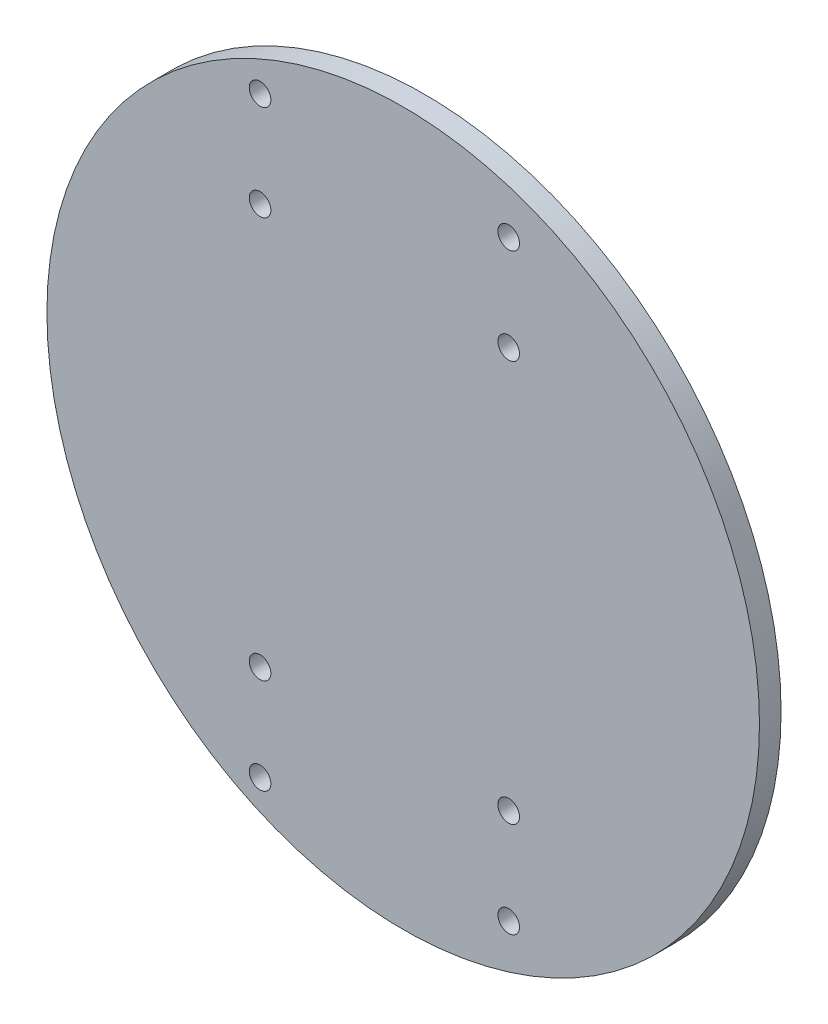
ISO-10303-21;
HEADER;
FILE_DESCRIPTION(('STEP AP214'),'2;1');
FILE_NAME('part.step','',(''),(''),'','','');
FILE_SCHEMA(('AUTOMOTIVE_DESIGN { 1 0 10303 214 1 1 1 1 }'));
ENDSEC;
DATA;
#1=APPLICATION_CONTEXT('core data for automotive mechanical design processes');
#2=APPLICATION_PROTOCOL_DEFINITION('international standard','automotive_design',2000,#1);
#3=PRODUCT_CONTEXT('',#1,'mechanical');
#4=PRODUCT('Part','Part','',(#3));
#5=PRODUCT_RELATED_PRODUCT_CATEGORY('part','',(#4));
#6=PRODUCT_DEFINITION_FORMATION('','',#4);
#7=PRODUCT_DEFINITION_CONTEXT('part definition',#1,'design');
#8=PRODUCT_DEFINITION('design','',#6,#7);
#9=PRODUCT_DEFINITION_SHAPE('','',#8);
#10=(LENGTH_UNIT() NAMED_UNIT(*) SI_UNIT(.MILLI.,.METRE.));
#11=(NAMED_UNIT(*) PLANE_ANGLE_UNIT() SI_UNIT($,.RADIAN.));
#12=(NAMED_UNIT(*) SI_UNIT($,.STERADIAN.) SOLID_ANGLE_UNIT());
#13=UNCERTAINTY_MEASURE_WITH_UNIT(LENGTH_MEASURE(1.E-05),#10,'distance_accuracy_value','');
#14=(GEOMETRIC_REPRESENTATION_CONTEXT(3) GLOBAL_UNCERTAINTY_ASSIGNED_CONTEXT((#13)) GLOBAL_UNIT_ASSIGNED_CONTEXT((#10,
#11,#12)) REPRESENTATION_CONTEXT('',''));
#15=CARTESIAN_POINT('',(0.,0.,0.));
#16=DIRECTION('',(0.,0.,1.));
#17=DIRECTION('',(1.,0.,0.));
#18=AXIS2_PLACEMENT_3D('',#15,#16,#17);
#19=CARTESIAN_POINT('',(0.,0.,5.));
#20=DIRECTION('',(0.,0.,1.));
#21=DIRECTION('',(1.,0.,0.));
#22=AXIS2_PLACEMENT_3D('',#19,#20,#21);
#23=PLANE('',#22);
#24=CARTESIAN_POINT('',(24.405,68.49,5.));
#25=DIRECTION('',(0.,0.,1.));
#26=DIRECTION('',(1.,0.,0.));
#27=AXIS2_PLACEMENT_3D('',#24,#25,#26);
#28=CIRCLE('',#27,2.5);
#29=CARTESIAN_POINT('',(26.905,68.49,5.));
#30=VERTEX_POINT('',#29);
#31=EDGE_CURVE('E156',#30,#30,#28,.F.);
#32=ORIENTED_EDGE('',*,*,#31,.T.);
#33=EDGE_LOOP('',(#32));
#34=FACE_BOUND('',#33,.T.);
#35=CARTESIAN_POINT('',(24.405,46.39,5.));
#36=DIRECTION('',(0.,0.,1.));
#37=DIRECTION('',(1.,0.,0.));
#38=AXIS2_PLACEMENT_3D('',#35,#36,#37);
#39=CIRCLE('',#38,2.5);
#40=CARTESIAN_POINT('',(26.905,46.39,5.));
#41=VERTEX_POINT('',#40);
#42=EDGE_CURVE('E158',#41,#41,#39,.F.);
#43=ORIENTED_EDGE('',*,*,#42,.T.);
#44=EDGE_LOOP('',(#43));
#45=FACE_BOUND('',#44,.T.);
#46=CARTESIAN_POINT('',(-33.115,46.39,5.));
#47=DIRECTION('',(0.,0.,1.));
#48=DIRECTION('',(1.,0.,0.));
#49=AXIS2_PLACEMENT_3D('',#46,#47,#48);
#50=CIRCLE('',#49,2.5);
#51=CARTESIAN_POINT('',(-30.615,46.39,5.));
#52=VERTEX_POINT('',#51);
#53=EDGE_CURVE('E163',#52,#52,#50,.F.);
#54=ORIENTED_EDGE('',*,*,#53,.T.);
#55=EDGE_LOOP('',(#54));
#56=FACE_BOUND('',#55,.T.);
#57=CARTESIAN_POINT('',(-33.115,68.49,5.));
#58=DIRECTION('',(0.,0.,1.));
#59=DIRECTION('',(1.,0.,0.));
#60=AXIS2_PLACEMENT_3D('',#57,#58,#59);
#61=CIRCLE('',#60,2.5);
#62=CARTESIAN_POINT('',(-30.615,68.49,5.));
#63=VERTEX_POINT('',#62);
#64=EDGE_CURVE('E60',#63,#63,#61,.F.);
#65=ORIENTED_EDGE('',*,*,#64,.T.);
#66=EDGE_LOOP('',(#65));
#67=FACE_BOUND('',#66,.T.);
#68=CARTESIAN_POINT('',(0.,0.,5.));
#69=DIRECTION('',(0.,0.,1.));
#70=DIRECTION('',(1.,0.,0.));
#71=AXIS2_PLACEMENT_3D('',#68,#69,#70);
#72=CIRCLE('',#71,82.42);
#73=CARTESIAN_POINT('',(82.42,0.,5.));
#74=VERTEX_POINT('',#73);
#75=EDGE_CURVE('E10',#74,#74,#72,.T.);
#76=ORIENTED_EDGE('',*,*,#75,.T.);
#77=EDGE_LOOP('',(#76));
#78=FACE_BOUND('',#77,.T.);
#79=CARTESIAN_POINT('',(-33.115,-68.49,5.));
#80=DIRECTION('',(0.,0.,1.));
#81=DIRECTION('',(1.,0.,0.));
#82=AXIS2_PLACEMENT_3D('',#79,#80,#81);
#83=CIRCLE('',#82,2.5);
#84=CARTESIAN_POINT('',(-30.615,-68.49,5.));
#85=VERTEX_POINT('',#84);
#86=EDGE_CURVE('E173',#85,#85,#83,.T.);
#87=ORIENTED_EDGE('',*,*,#86,.F.);
#88=EDGE_LOOP('',(#87));
#89=FACE_BOUND('',#88,.T.);
#90=CARTESIAN_POINT('',(24.405,-46.39,5.));
#91=DIRECTION('',(0.,0.,1.));
#92=DIRECTION('',(1.,0.,0.));
#93=AXIS2_PLACEMENT_3D('',#90,#91,#92);
#94=CIRCLE('',#93,2.5);
#95=CARTESIAN_POINT('',(26.905,-46.39,5.));
#96=VERTEX_POINT('',#95);
#97=EDGE_CURVE('E166',#96,#96,#94,.T.);
#98=ORIENTED_EDGE('',*,*,#97,.F.);
#99=EDGE_LOOP('',(#98));
#100=FACE_BOUND('',#99,.T.);
#101=CARTESIAN_POINT('',(24.405,-68.49,5.));
#102=DIRECTION('',(0.,0.,1.));
#103=DIRECTION('',(1.,0.,0.));
#104=AXIS2_PLACEMENT_3D('',#101,#102,#103);
#105=CIRCLE('',#104,2.5);
#106=CARTESIAN_POINT('',(26.905,-68.49,5.));
#107=VERTEX_POINT('',#106);
#108=EDGE_CURVE('E180',#107,#107,#105,.T.);
#109=ORIENTED_EDGE('',*,*,#108,.F.);
#110=EDGE_LOOP('',(#109));
#111=FACE_BOUND('',#110,.T.);
#112=CARTESIAN_POINT('',(-33.115,-46.39,5.));
#113=DIRECTION('',(0.,0.,1.));
#114=DIRECTION('',(1.,0.,0.));
#115=AXIS2_PLACEMENT_3D('',#112,#113,#114);
#116=CIRCLE('',#115,2.5);
#117=CARTESIAN_POINT('',(-30.615,-46.39,5.));
#118=VERTEX_POINT('',#117);
#119=EDGE_CURVE('E171',#118,#118,#116,.T.);
#120=ORIENTED_EDGE('',*,*,#119,.F.);
#121=EDGE_LOOP('',(#120));
#122=FACE_BOUND('',#121,.T.);
#123=ADVANCED_FACE('F43',(#34,#45,#56,#67,#78,#89,#100,#111,#122),#23,.T.);
#124=CARTESIAN_POINT('',(0.,0.,0.));
#125=DIRECTION('',(0.,0.,1.));
#126=DIRECTION('',(1.,0.,0.));
#127=AXIS2_PLACEMENT_3D('',#124,#125,#126);
#128=PLANE('',#127);
#129=CARTESIAN_POINT('',(24.405,68.49,0.));
#130=DIRECTION('',(0.,0.,1.));
#131=DIRECTION('',(1.,0.,0.));
#132=AXIS2_PLACEMENT_3D('',#129,#130,#131);
#133=CIRCLE('',#132,2.5);
#134=CARTESIAN_POINT('',(26.905,68.49,0.));
#135=VERTEX_POINT('',#134);
#136=EDGE_CURVE('E47',#135,#135,#133,.F.);
#137=ORIENTED_EDGE('',*,*,#136,.F.);
#138=EDGE_LOOP('',(#137));
#139=FACE_BOUND('',#138,.T.);
#140=CARTESIAN_POINT('',(24.405,46.39,0.));
#141=DIRECTION('',(0.,0.,1.));
#142=DIRECTION('',(1.,0.,0.));
#143=AXIS2_PLACEMENT_3D('',#140,#141,#142);
#144=CIRCLE('',#143,2.5);
#145=CARTESIAN_POINT('',(26.905,46.39,0.));
#146=VERTEX_POINT('',#145);
#147=EDGE_CURVE('E86',#146,#146,#144,.F.);
#148=ORIENTED_EDGE('',*,*,#147,.F.);
#149=EDGE_LOOP('',(#148));
#150=FACE_BOUND('',#149,.T.);
#151=CARTESIAN_POINT('',(-33.115,46.39,0.));
#152=DIRECTION('',(0.,0.,1.));
#153=DIRECTION('',(1.,0.,0.));
#154=AXIS2_PLACEMENT_3D('',#151,#152,#153);
#155=CIRCLE('',#154,2.5);
#156=CARTESIAN_POINT('',(-30.615,46.39,0.));
#157=VERTEX_POINT('',#156);
#158=EDGE_CURVE('E83',#157,#157,#155,.F.);
#159=ORIENTED_EDGE('',*,*,#158,.F.);
#160=EDGE_LOOP('',(#159));
#161=FACE_BOUND('',#160,.T.);
#162=CARTESIAN_POINT('',(24.405,-68.49,0.));
#163=DIRECTION('',(0.,0.,1.));
#164=DIRECTION('',(1.,0.,0.));
#165=AXIS2_PLACEMENT_3D('',#162,#163,#164);
#166=CIRCLE('',#165,2.5);
#167=CARTESIAN_POINT('',(26.905,-68.49,0.));
#168=VERTEX_POINT('',#167);
#169=EDGE_CURVE('E75',#168,#168,#166,.T.);
#170=ORIENTED_EDGE('',*,*,#169,.T.);
#171=EDGE_LOOP('',(#170));
#172=FACE_BOUND('',#171,.T.);
#173=CARTESIAN_POINT('',(-33.115,-68.49,0.));
#174=DIRECTION('',(0.,0.,1.));
#175=DIRECTION('',(1.,0.,0.));
#176=AXIS2_PLACEMENT_3D('',#173,#174,#175);
#177=CIRCLE('',#176,2.5);
#178=CARTESIAN_POINT('',(-30.615,-68.49,0.));
#179=VERTEX_POINT('',#178);
#180=EDGE_CURVE('E67',#179,#179,#177,.T.);
#181=ORIENTED_EDGE('',*,*,#180,.T.);
#182=EDGE_LOOP('',(#181));
#183=FACE_BOUND('',#182,.T.);
#184=CARTESIAN_POINT('',(-33.115,68.49,0.));
#185=DIRECTION('',(0.,0.,1.));
#186=DIRECTION('',(1.,0.,0.));
#187=AXIS2_PLACEMENT_3D('',#184,#185,#186);
#188=CIRCLE('',#187,2.5);
#189=CARTESIAN_POINT('',(-30.615,68.49,0.));
#190=VERTEX_POINT('',#189);
#191=EDGE_CURVE('E63',#190,#190,#188,.F.);
#192=ORIENTED_EDGE('',*,*,#191,.F.);
#193=EDGE_LOOP('',(#192));
#194=FACE_BOUND('',#193,.T.);
#195=CARTESIAN_POINT('',(0.,0.,0.));
#196=DIRECTION('',(0.,0.,1.));
#197=DIRECTION('',(1.,0.,0.));
#198=AXIS2_PLACEMENT_3D('',#195,#196,#197);
#199=CIRCLE('',#198,82.42);
#200=CARTESIAN_POINT('',(82.42,0.,0.));
#201=VERTEX_POINT('',#200);
#202=EDGE_CURVE('E52',#201,#201,#199,.T.);
#203=ORIENTED_EDGE('',*,*,#202,.F.);
#204=EDGE_LOOP('',(#203));
#205=FACE_BOUND('',#204,.T.);
#206=CARTESIAN_POINT('',(24.405,-46.39,0.));
#207=DIRECTION('',(0.,0.,1.));
#208=DIRECTION('',(1.,0.,0.));
#209=AXIS2_PLACEMENT_3D('',#206,#207,#208);
#210=CIRCLE('',#209,2.5);
#211=CARTESIAN_POINT('',(26.905,-46.39,0.));
#212=VERTEX_POINT('',#211);
#213=EDGE_CURVE('E71',#212,#212,#210,.T.);
#214=ORIENTED_EDGE('',*,*,#213,.T.);
#215=EDGE_LOOP('',(#214));
#216=FACE_BOUND('',#215,.T.);
#217=CARTESIAN_POINT('',(-33.115,-46.39,0.));
#218=DIRECTION('',(0.,0.,1.));
#219=DIRECTION('',(1.,0.,0.));
#220=AXIS2_PLACEMENT_3D('',#217,#218,#219);
#221=CIRCLE('',#220,2.5);
#222=CARTESIAN_POINT('',(-30.615,-46.39,0.));
#223=VERTEX_POINT('',#222);
#224=EDGE_CURVE('E79',#223,#223,#221,.T.);
#225=ORIENTED_EDGE('',*,*,#224,.T.);
#226=EDGE_LOOP('',(#225));
#227=FACE_BOUND('',#226,.T.);
#228=ADVANCED_FACE('F97',(#139,#150,#161,#172,#183,#194,#205,#216,#227),#128,.F.);
#229=CARTESIAN_POINT('',(0.,0.,5.));
#230=DIRECTION('',(0.,0.,-1.));
#231=DIRECTION('',(-1.,0.,0.));
#232=AXIS2_PLACEMENT_3D('',#229,#230,#231);
#233=CYLINDRICAL_SURFACE('',#232,82.42);
#234=ORIENTED_EDGE('',*,*,#75,.F.);
#235=EDGE_LOOP('',(#234));
#236=FACE_BOUND('',#235,.T.);
#237=ORIENTED_EDGE('',*,*,#202,.T.);
#238=EDGE_LOOP('',(#237));
#239=FACE_BOUND('',#238,.T.);
#240=ADVANCED_FACE('F45',(#236,#239),#233,.T.);
#241=CARTESIAN_POINT('',(-33.115,68.49,-5.));
#242=DIRECTION('',(0.,0.,1.));
#243=DIRECTION('',(1.,0.,0.));
#244=AXIS2_PLACEMENT_3D('',#241,#242,#243);
#245=CYLINDRICAL_SURFACE('',#244,2.5);
#246=ORIENTED_EDGE('',*,*,#64,.F.);
#247=EDGE_LOOP('',(#246));
#248=FACE_BOUND('',#247,.T.);
#249=ORIENTED_EDGE('',*,*,#191,.T.);
#250=EDGE_LOOP('',(#249));
#251=FACE_BOUND('',#250,.T.);
#252=ADVANCED_FACE('F141',(#248,#251),#245,.F.);
#253=CARTESIAN_POINT('',(-33.115,-68.49,-5.));
#254=DIRECTION('',(0.,0.,1.));
#255=DIRECTION('',(1.,0.,0.));
#256=AXIS2_PLACEMENT_3D('',#253,#254,#255);
#257=CYLINDRICAL_SURFACE('',#256,2.5);
#258=ORIENTED_EDGE('',*,*,#86,.T.);
#259=EDGE_LOOP('',(#258));
#260=FACE_BOUND('',#259,.T.);
#261=ORIENTED_EDGE('',*,*,#180,.F.);
#262=EDGE_LOOP('',(#261));
#263=FACE_BOUND('',#262,.T.);
#264=ADVANCED_FACE('F143',(#260,#263),#257,.F.);
#265=CARTESIAN_POINT('',(24.405,-46.39,-5.));
#266=DIRECTION('',(0.,0.,1.));
#267=DIRECTION('',(1.,0.,0.));
#268=AXIS2_PLACEMENT_3D('',#265,#266,#267);
#269=CYLINDRICAL_SURFACE('',#268,2.5);
#270=ORIENTED_EDGE('',*,*,#97,.T.);
#271=EDGE_LOOP('',(#270));
#272=FACE_BOUND('',#271,.T.);
#273=ORIENTED_EDGE('',*,*,#213,.F.);
#274=EDGE_LOOP('',(#273));
#275=FACE_BOUND('',#274,.T.);
#276=ADVANCED_FACE('F128',(#272,#275),#269,.F.);
#277=CARTESIAN_POINT('',(24.405,-68.49,-5.));
#278=DIRECTION('',(0.,0.,1.));
#279=DIRECTION('',(1.,0.,0.));
#280=AXIS2_PLACEMENT_3D('',#277,#278,#279);
#281=CYLINDRICAL_SURFACE('',#280,2.5);
#282=ORIENTED_EDGE('',*,*,#108,.T.);
#283=EDGE_LOOP('',(#282));
#284=FACE_BOUND('',#283,.T.);
#285=ORIENTED_EDGE('',*,*,#169,.F.);
#286=EDGE_LOOP('',(#285));
#287=FACE_BOUND('',#286,.T.);
#288=ADVANCED_FACE('F118',(#284,#287),#281,.F.);
#289=CARTESIAN_POINT('',(-33.115,-46.39,-5.));
#290=DIRECTION('',(0.,0.,1.));
#291=DIRECTION('',(1.,0.,0.));
#292=AXIS2_PLACEMENT_3D('',#289,#290,#291);
#293=CYLINDRICAL_SURFACE('',#292,2.5);
#294=ORIENTED_EDGE('',*,*,#119,.T.);
#295=EDGE_LOOP('',(#294));
#296=FACE_BOUND('',#295,.T.);
#297=ORIENTED_EDGE('',*,*,#224,.F.);
#298=EDGE_LOOP('',(#297));
#299=FACE_BOUND('',#298,.T.);
#300=ADVANCED_FACE('F115',(#296,#299),#293,.F.);
#301=CARTESIAN_POINT('',(-33.115,46.39,-5.));
#302=DIRECTION('',(0.,0.,1.));
#303=DIRECTION('',(1.,0.,0.));
#304=AXIS2_PLACEMENT_3D('',#301,#302,#303);
#305=CYLINDRICAL_SURFACE('',#304,2.5);
#306=ORIENTED_EDGE('',*,*,#53,.F.);
#307=EDGE_LOOP('',(#306));
#308=FACE_BOUND('',#307,.T.);
#309=ORIENTED_EDGE('',*,*,#158,.T.);
#310=EDGE_LOOP('',(#309));
#311=FACE_BOUND('',#310,.T.);
#312=ADVANCED_FACE('F117',(#308,#311),#305,.F.);
#313=CARTESIAN_POINT('',(24.405,46.39,-5.));
#314=DIRECTION('',(0.,0.,1.));
#315=DIRECTION('',(1.,0.,0.));
#316=AXIS2_PLACEMENT_3D('',#313,#314,#315);
#317=CYLINDRICAL_SURFACE('',#316,2.5);
#318=ORIENTED_EDGE('',*,*,#42,.F.);
#319=EDGE_LOOP('',(#318));
#320=FACE_BOUND('',#319,.T.);
#321=ORIENTED_EDGE('',*,*,#147,.T.);
#322=EDGE_LOOP('',(#321));
#323=FACE_BOUND('',#322,.T.);
#324=ADVANCED_FACE('F125',(#320,#323),#317,.F.);
#325=CARTESIAN_POINT('',(24.405,68.49,-5.));
#326=DIRECTION('',(0.,0.,1.));
#327=DIRECTION('',(1.,0.,0.));
#328=AXIS2_PLACEMENT_3D('',#325,#326,#327);
#329=CYLINDRICAL_SURFACE('',#328,2.5);
#330=ORIENTED_EDGE('',*,*,#31,.F.);
#331=EDGE_LOOP('',(#330));
#332=FACE_BOUND('',#331,.T.);
#333=ORIENTED_EDGE('',*,*,#136,.T.);
#334=EDGE_LOOP('',(#333));
#335=FACE_BOUND('',#334,.T.);
#336=ADVANCED_FACE('F95',(#332,#335),#329,.F.);
#337=CLOSED_SHELL('',(#123,#228,#240,#252,#264,#276,#288,#300,#312,#324,#336));
#338=MANIFOLD_SOLID_BREP('B2',#337);
#339=ADVANCED_BREP_SHAPE_REPRESENTATION('',(#18,#338),#14);
#340=SHAPE_DEFINITION_REPRESENTATION(#9,#339);
ENDSEC;
END-ISO-10303-21;
